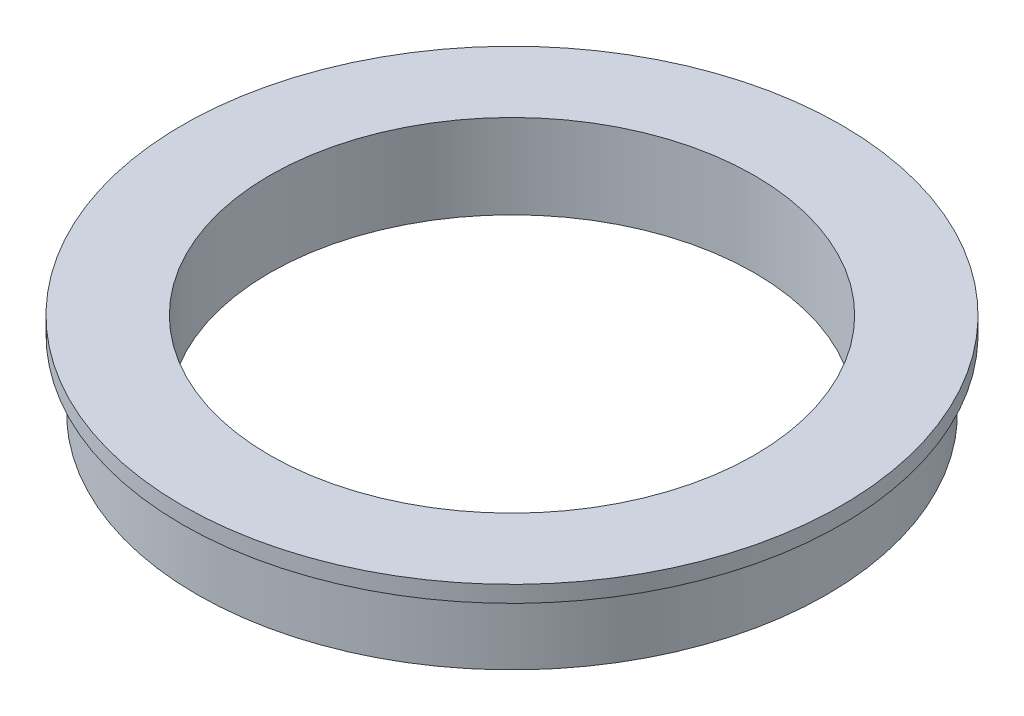
ISO-10303-21;
HEADER;
FILE_DESCRIPTION(('STEP AP214'),'2;1');
FILE_NAME('part.step','',(''),(''),'','','');
FILE_SCHEMA(('AUTOMOTIVE_DESIGN { 1 0 10303 214 1 1 1 1 }'));
ENDSEC;
DATA;
#1=APPLICATION_CONTEXT('core data for automotive mechanical design processes');
#2=APPLICATION_PROTOCOL_DEFINITION('international standard','automotive_design',2000,#1);
#3=PRODUCT_CONTEXT('',#1,'mechanical');
#4=PRODUCT('Part','Part','',(#3));
#5=PRODUCT_RELATED_PRODUCT_CATEGORY('part','',(#4));
#6=PRODUCT_DEFINITION_FORMATION('','',#4);
#7=PRODUCT_DEFINITION_CONTEXT('part definition',#1,'design');
#8=PRODUCT_DEFINITION('design','',#6,#7);
#9=PRODUCT_DEFINITION_SHAPE('','',#8);
#10=(LENGTH_UNIT() NAMED_UNIT(*) SI_UNIT(.MILLI.,.METRE.));
#11=(NAMED_UNIT(*) PLANE_ANGLE_UNIT() SI_UNIT($,.RADIAN.));
#12=(NAMED_UNIT(*) SI_UNIT($,.STERADIAN.) SOLID_ANGLE_UNIT());
#13=UNCERTAINTY_MEASURE_WITH_UNIT(LENGTH_MEASURE(1.E-05),#10,'distance_accuracy_value','');
#14=(GEOMETRIC_REPRESENTATION_CONTEXT(3) GLOBAL_UNCERTAINTY_ASSIGNED_CONTEXT((#13)) GLOBAL_UNIT_ASSIGNED_CONTEXT((#10,
#11,#12)) REPRESENTATION_CONTEXT('',''));
#15=CARTESIAN_POINT('',(0.,0.,0.));
#16=DIRECTION('',(0.,0.,1.));
#17=DIRECTION('',(1.,0.,0.));
#18=AXIS2_PLACEMENT_3D('',#15,#16,#17);
#19=CARTESIAN_POINT('',(0.,0.,0.));
#20=DIRECTION('',(0.,1.,0.));
#21=DIRECTION('',(0.,0.,1.));
#22=AXIS2_PLACEMENT_3D('',#19,#20,#21);
#23=PLANE('',#22);
#24=CARTESIAN_POINT('',(0.,0.,0.));
#25=DIRECTION('',(0.,1.,0.));
#26=DIRECTION('',(0.,0.,1.));
#27=AXIS2_PLACEMENT_3D('',#24,#25,#26);
#28=CIRCLE('',#27,32.5);
#29=CARTESIAN_POINT('',(0.,0.,32.5));
#30=VERTEX_POINT('',#29);
#31=EDGE_CURVE('E43',#30,#30,#28,.T.);
#32=ORIENTED_EDGE('',*,*,#31,.F.);
#33=EDGE_LOOP('',(#32));
#34=FACE_BOUND('',#33,.T.);
#35=CARTESIAN_POINT('',(0.,0.,0.));
#36=DIRECTION('',(0.,1.,0.));
#37=DIRECTION('',(0.,0.,1.));
#38=AXIS2_PLACEMENT_3D('',#35,#36,#37);
#39=CIRCLE('',#38,25.);
#40=CARTESIAN_POINT('',(0.,0.,25.));
#41=VERTEX_POINT('',#40);
#42=EDGE_CURVE('E50',#41,#41,#39,.T.);
#43=ORIENTED_EDGE('',*,*,#42,.T.);
#44=EDGE_LOOP('',(#43));
#45=FACE_BOUND('',#44,.T.);
#46=ADVANCED_FACE('F39',(#34,#45),#23,.F.);
#47=CARTESIAN_POINT('',(0.,7.,0.));
#48=DIRECTION('',(0.,-1.,0.));
#49=DIRECTION('',(0.,0.,-1.));
#50=AXIS2_PLACEMENT_3D('',#47,#48,#49);
#51=CYLINDRICAL_SURFACE('',#50,32.5);
#52=CARTESIAN_POINT('',(0.,7.,0.));
#53=DIRECTION('',(0.,1.,0.));
#54=DIRECTION('',(0.,0.,1.));
#55=AXIS2_PLACEMENT_3D('',#52,#53,#54);
#56=CIRCLE('',#55,32.5);
#57=CARTESIAN_POINT('',(0.,7.,32.5));
#58=VERTEX_POINT('',#57);
#59=EDGE_CURVE('E10',#58,#58,#56,.T.);
#60=ORIENTED_EDGE('',*,*,#59,.F.);
#61=EDGE_LOOP('',(#60));
#62=FACE_BOUND('',#61,.T.);
#63=ORIENTED_EDGE('',*,*,#31,.T.);
#64=EDGE_LOOP('',(#63));
#65=FACE_BOUND('',#64,.T.);
#66=ADVANCED_FACE('F41',(#62,#65),#51,.T.);
#67=CARTESIAN_POINT('',(0.,7.,0.));
#68=DIRECTION('',(0.,-1.,0.));
#69=DIRECTION('',(0.,0.,-1.));
#70=AXIS2_PLACEMENT_3D('',#67,#68,#69);
#71=CYLINDRICAL_SURFACE('',#70,25.);
#72=ORIENTED_EDGE('',*,*,#42,.F.);
#73=EDGE_LOOP('',(#72));
#74=FACE_BOUND('',#73,.T.);
#75=CARTESIAN_POINT('',(0.,8.7,0.));
#76=DIRECTION('',(0.,1.,0.));
#77=DIRECTION('',(0.,0.,1.));
#78=AXIS2_PLACEMENT_3D('',#75,#76,#77);
#79=CIRCLE('',#78,25.);
#80=CARTESIAN_POINT('',(0.,8.7,25.));
#81=VERTEX_POINT('',#80);
#82=EDGE_CURVE('E58',#81,#81,#79,.T.);
#83=ORIENTED_EDGE('',*,*,#82,.T.);
#84=EDGE_LOOP('',(#83));
#85=FACE_BOUND('',#84,.T.);
#86=ADVANCED_FACE('F64',(#74,#85),#71,.F.);
#87=CARTESIAN_POINT('',(0.,8.7,0.));
#88=DIRECTION('',(0.,1.,0.));
#89=DIRECTION('',(0.,0.,1.));
#90=AXIS2_PLACEMENT_3D('',#87,#88,#89);
#91=PLANE('',#90);
#92=CARTESIAN_POINT('',(0.,8.7,0.));
#93=DIRECTION('',(0.,1.,0.));
#94=DIRECTION('',(0.,0.,1.));
#95=AXIS2_PLACEMENT_3D('',#92,#93,#94);
#96=CIRCLE('',#95,34.);
#97=CARTESIAN_POINT('',(0.,8.7,34.));
#98=VERTEX_POINT('',#97);
#99=EDGE_CURVE('E54',#98,#98,#96,.T.);
#100=ORIENTED_EDGE('',*,*,#99,.T.);
#101=EDGE_LOOP('',(#100));
#102=FACE_BOUND('',#101,.T.);
#103=ORIENTED_EDGE('',*,*,#82,.F.);
#104=EDGE_LOOP('',(#103));
#105=FACE_BOUND('',#104,.T.);
#106=ADVANCED_FACE('F66',(#102,#105),#91,.T.);
#107=CARTESIAN_POINT('',(0.,7.,0.));
#108=DIRECTION('',(0.,1.,0.));
#109=DIRECTION('',(0.,0.,1.));
#110=AXIS2_PLACEMENT_3D('',#107,#108,#109);
#111=PLANE('',#110);
#112=ORIENTED_EDGE('',*,*,#59,.T.);
#113=EDGE_LOOP('',(#112));
#114=FACE_BOUND('',#113,.T.);
#115=CARTESIAN_POINT('',(0.,7.,0.));
#116=DIRECTION('',(0.,1.,0.));
#117=DIRECTION('',(0.,0.,1.));
#118=AXIS2_PLACEMENT_3D('',#115,#116,#117);
#119=CIRCLE('',#118,34.);
#120=CARTESIAN_POINT('',(0.,7.,34.));
#121=VERTEX_POINT('',#120);
#122=EDGE_CURVE('E55',#121,#121,#119,.T.);
#123=ORIENTED_EDGE('',*,*,#122,.F.);
#124=EDGE_LOOP('',(#123));
#125=FACE_BOUND('',#124,.T.);
#126=ADVANCED_FACE('F68',(#114,#125),#111,.F.);
#127=CARTESIAN_POINT('',(0.,8.7,0.));
#128=DIRECTION('',(0.,-1.,0.));
#129=DIRECTION('',(0.,0.,-1.));
#130=AXIS2_PLACEMENT_3D('',#127,#128,#129);
#131=CYLINDRICAL_SURFACE('',#130,34.);
#132=ORIENTED_EDGE('',*,*,#99,.F.);
#133=EDGE_LOOP('',(#132));
#134=FACE_BOUND('',#133,.T.);
#135=ORIENTED_EDGE('',*,*,#122,.T.);
#136=EDGE_LOOP('',(#135));
#137=FACE_BOUND('',#136,.T.);
#138=ADVANCED_FACE('F75',(#134,#137),#131,.T.);
#139=CLOSED_SHELL('',(#46,#66,#86,#106,#126,#138));
#140=MANIFOLD_SOLID_BREP('B2',#139);
#141=ADVANCED_BREP_SHAPE_REPRESENTATION('',(#18,#140),#14);
#142=SHAPE_DEFINITION_REPRESENTATION(#9,#141);
ENDSEC;
END-ISO-10303-21;
